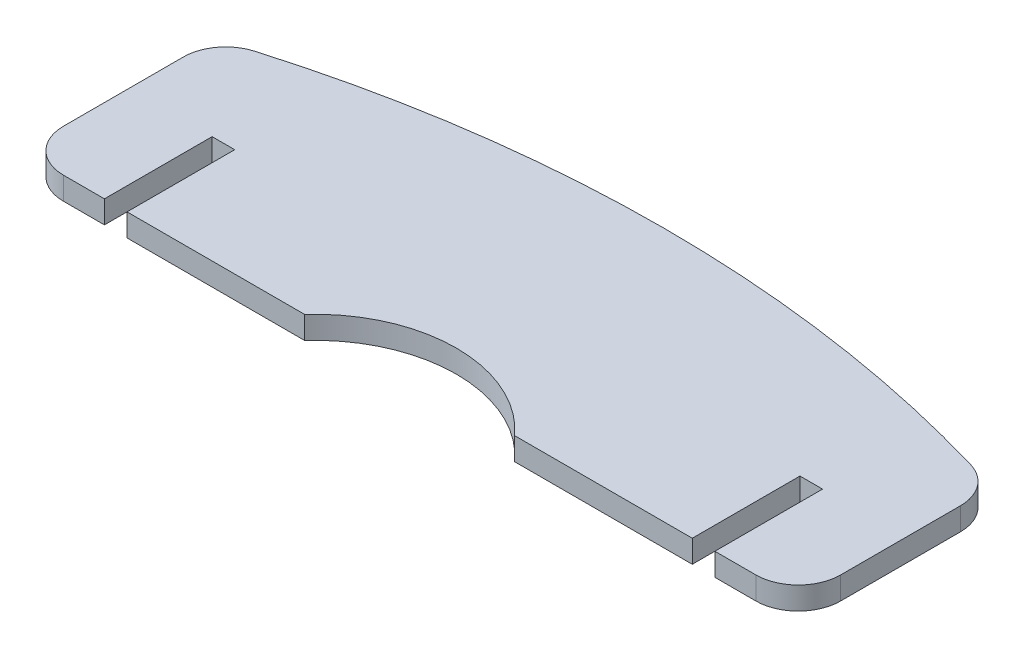
ISO-10303-21;
HEADER;
FILE_DESCRIPTION(('STEP AP214'),'2;1');
FILE_NAME('part.step','',(''),(''),'','','');
FILE_SCHEMA(('AUTOMOTIVE_DESIGN { 1 0 10303 214 1 1 1 1 }'));
ENDSEC;
DATA;
#1=APPLICATION_CONTEXT('core data for automotive mechanical design processes');
#2=APPLICATION_PROTOCOL_DEFINITION('international standard','automotive_design',2000,#1);
#3=PRODUCT_CONTEXT('',#1,'mechanical');
#4=PRODUCT('Part','Part','',(#3));
#5=PRODUCT_RELATED_PRODUCT_CATEGORY('part','',(#4));
#6=PRODUCT_DEFINITION_FORMATION('','',#4);
#7=PRODUCT_DEFINITION_CONTEXT('part definition',#1,'design');
#8=PRODUCT_DEFINITION('design','',#6,#7);
#9=PRODUCT_DEFINITION_SHAPE('','',#8);
#10=(LENGTH_UNIT() NAMED_UNIT(*) SI_UNIT(.MILLI.,.METRE.));
#11=(NAMED_UNIT(*) PLANE_ANGLE_UNIT() SI_UNIT($,.RADIAN.));
#12=(NAMED_UNIT(*) SI_UNIT($,.STERADIAN.) SOLID_ANGLE_UNIT());
#13=UNCERTAINTY_MEASURE_WITH_UNIT(LENGTH_MEASURE(1.E-05),#10,'distance_accuracy_value','');
#14=(GEOMETRIC_REPRESENTATION_CONTEXT(3) GLOBAL_UNCERTAINTY_ASSIGNED_CONTEXT((#13)) GLOBAL_UNIT_ASSIGNED_CONTEXT((#10,
#11,#12)) REPRESENTATION_CONTEXT('',''));
#15=CARTESIAN_POINT('',(0.,0.,0.));
#16=DIRECTION('',(0.,0.,1.));
#17=DIRECTION('',(1.,0.,0.));
#18=AXIS2_PLACEMENT_3D('',#15,#16,#17);
#19=CARTESIAN_POINT('',(-27.5,0.8,13.6956824379666));
#20=DIRECTION('',(0.,0.,-1.));
#21=DIRECTION('',(-1.,0.,0.));
#22=AXIS2_PLACEMENT_3D('',#19,#20,#21);
#23=PLANE('',#22);
#24=DIRECTION('',(1.,0.,0.));
#25=VECTOR('',#24,1.);
#26=CARTESIAN_POINT('',(-27.5,0.8,13.6956824379666));
#27=LINE('',#26,#25);
#28=CARTESIAN_POINT('',(7.42975818723065,0.799999999999995,13.6956824379666));
#29=VERTEX_POINT('',#28);
#30=CARTESIAN_POINT('',(20.,0.8,13.6956824379666));
#31=VERTEX_POINT('',#30);
#32=EDGE_CURVE('E178',#29,#31,#27,.T.);
#33=ORIENTED_EDGE('',*,*,#32,.F.);
#34=DIRECTION('',(0.,-1.,0.));
#35=VECTOR('',#34,1.);
#36=CARTESIAN_POINT('',(7.4297581872306,73.165824116084,13.6956824379666));
#37=LINE('',#36,#35);
#38=CARTESIAN_POINT('',(7.4297581872306,-0.799999999999995,13.6956824379666));
#39=VERTEX_POINT('',#38);
#40=EDGE_CURVE('E177',#29,#39,#37,.T.);
#41=ORIENTED_EDGE('',*,*,#40,.T.);
#42=DIRECTION('',(1.,0.,0.));
#43=VECTOR('',#42,1.);
#44=CARTESIAN_POINT('',(-27.5,-0.8,13.6956824379666));
#45=LINE('',#44,#43);
#46=CARTESIAN_POINT('',(20.,-0.8,13.6956824379666));
#47=VERTEX_POINT('',#46);
#48=EDGE_CURVE('E162',#39,#47,#45,.T.);
#49=ORIENTED_EDGE('',*,*,#48,.T.);
#50=DIRECTION('',(0.,1.,0.));
#51=VECTOR('',#50,1.);
#52=CARTESIAN_POINT('',(20.,-0.8,13.6956824379666));
#53=LINE('',#52,#51);
#54=EDGE_CURVE('E206',#47,#31,#53,.T.);
#55=ORIENTED_EDGE('',*,*,#54,.T.);
#56=EDGE_LOOP('',(#33,#41,#49,#55));
#57=FACE_BOUND('',#56,.T.);
#58=ADVANCED_FACE('F36',(#57),#23,.F.);
#59=CARTESIAN_POINT('',(21.6,0.8,13.6956824379666));
#60=VERTEX_POINT('',#59);
#61=CARTESIAN_POINT('',(24.5,0.8,13.6956824379666));
#62=VERTEX_POINT('',#61);
#63=EDGE_CURVE('E282',#60,#62,#27,.T.);
#64=ORIENTED_EDGE('',*,*,#63,.F.);
#65=DIRECTION('',(0.,1.,0.));
#66=VECTOR('',#65,1.);
#67=CARTESIAN_POINT('',(21.6,-0.8,13.6956824379666));
#68=LINE('',#67,#66);
#69=CARTESIAN_POINT('',(21.6,-0.8,13.6956824379666));
#70=VERTEX_POINT('',#69);
#71=EDGE_CURVE('E204',#70,#60,#68,.T.);
#72=ORIENTED_EDGE('',*,*,#71,.F.);
#73=CARTESIAN_POINT('',(24.5,-0.8,13.6956824379666));
#74=VERTEX_POINT('',#73);
#75=EDGE_CURVE('E173',#70,#74,#45,.T.);
#76=ORIENTED_EDGE('',*,*,#75,.T.);
#77=DIRECTION('',(0.,1.,0.));
#78=VECTOR('',#77,1.);
#79=CARTESIAN_POINT('',(24.5,-0.8,13.6956824379666));
#80=LINE('',#79,#78);
#81=EDGE_CURVE('E255',#74,#62,#80,.T.);
#82=ORIENTED_EDGE('',*,*,#81,.T.);
#83=EDGE_LOOP('',(#64,#72,#76,#82));
#84=FACE_BOUND('',#83,.T.);
#85=ADVANCED_FACE('F319',(#84),#23,.F.);
#86=CARTESIAN_POINT('',(-24.5,-0.8,13.6956824379666));
#87=VERTEX_POINT('',#86);
#88=CARTESIAN_POINT('',(-21.6,-0.8,13.6956824379666));
#89=VERTEX_POINT('',#88);
#90=EDGE_CURVE('E175',#87,#89,#45,.T.);
#91=ORIENTED_EDGE('',*,*,#90,.T.);
#92=DIRECTION('',(0.,1.,0.));
#93=VECTOR('',#92,1.);
#94=CARTESIAN_POINT('',(-21.6,-0.8,13.6956824379666));
#95=LINE('',#94,#93);
#96=CARTESIAN_POINT('',(-21.6,0.8,13.6956824379666));
#97=VERTEX_POINT('',#96);
#98=EDGE_CURVE('E219',#89,#97,#95,.T.);
#99=ORIENTED_EDGE('',*,*,#98,.T.);
#100=CARTESIAN_POINT('',(-24.5,0.8,13.6956824379666));
#101=VERTEX_POINT('',#100);
#102=EDGE_CURVE('E283',#101,#97,#27,.T.);
#103=ORIENTED_EDGE('',*,*,#102,.F.);
#104=DIRECTION('',(0.,1.,0.));
#105=VECTOR('',#104,1.);
#106=CARTESIAN_POINT('',(-24.5,-0.8,13.6956824379666));
#107=LINE('',#106,#105);
#108=EDGE_CURVE('E259',#87,#101,#107,.T.);
#109=ORIENTED_EDGE('',*,*,#108,.F.);
#110=EDGE_LOOP('',(#91,#99,#103,#109));
#111=FACE_BOUND('',#110,.T.);
#112=ADVANCED_FACE('F338',(#111),#23,.F.);
#113=CARTESIAN_POINT('',(0.,0.8,85.695681103124));
#114=DIRECTION('',(0.,-1.,0.));
#115=DIRECTION('',(0.,0.,-1.));
#116=AXIS2_PLACEMENT_3D('',#113,#114,#115);
#117=CYLINDRICAL_SURFACE('',#116,89.9999986651574);
#118=CARTESIAN_POINT('',(0.,-0.8,85.695681103124));
#119=DIRECTION('',(0.,1.,0.));
#120=DIRECTION('',(0.,0.,-1.));
#121=AXIS2_PLACEMENT_3D('',#118,#119,#120);
#122=CIRCLE('',#121,89.9999986651574);
#123=CARTESIAN_POINT('',(25.3448275991691,-0.8,-0.661944348811162));
#124=VERTEX_POINT('',#123);
#125=CARTESIAN_POINT('',(-25.3448275991691,-0.8,-0.661944348811144));
#126=VERTEX_POINT('',#125);
#127=EDGE_CURVE('E258',#124,#126,#122,.T.);
#128=ORIENTED_EDGE('',*,*,#127,.T.);
#129=DIRECTION('',(0.,1.,0.));
#130=VECTOR('',#129,1.);
#131=CARTESIAN_POINT('',(-25.3448275991691,-0.8,-0.661944348811144));
#132=LINE('',#131,#130);
#133=CARTESIAN_POINT('',(-25.3448275991691,0.8,-0.661944348811144));
#134=VERTEX_POINT('',#133);
#135=EDGE_CURVE('E266',#126,#134,#132,.T.);
#136=ORIENTED_EDGE('',*,*,#135,.T.);
#137=CARTESIAN_POINT('',(0.,0.8,85.695681103124));
#138=DIRECTION('',(0.,1.,0.));
#139=DIRECTION('',(0.,0.,-1.));
#140=AXIS2_PLACEMENT_3D('',#137,#138,#139);
#141=CIRCLE('',#140,89.9999986651574);
#142=CARTESIAN_POINT('',(25.3448275991691,0.8,-0.661944348811162));
#143=VERTEX_POINT('',#142);
#144=EDGE_CURVE('E275',#143,#134,#141,.T.);
#145=ORIENTED_EDGE('',*,*,#144,.F.);
#146=DIRECTION('',(0.,1.,0.));
#147=VECTOR('',#146,1.);
#148=CARTESIAN_POINT('',(25.3448275991691,-0.8,-0.661944348811162));
#149=LINE('',#148,#147);
#150=EDGE_CURVE('E269',#124,#143,#149,.T.);
#151=ORIENTED_EDGE('',*,*,#150,.F.);
#152=EDGE_LOOP('',(#128,#136,#145,#151));
#153=FACE_BOUND('',#152,.T.);
#154=ADVANCED_FACE('F38',(#153),#117,.T.);
#155=CARTESIAN_POINT('',(-27.5,0.8,0.));
#156=DIRECTION('',(1.,0.,0.));
#157=DIRECTION('',(0.,0.,-1.));
#158=AXIS2_PLACEMENT_3D('',#155,#156,#157);
#159=PLANE('',#158);
#160=DIRECTION('',(0.,0.,1.));
#161=VECTOR('',#160,1.);
#162=CARTESIAN_POINT('',(-27.5,-0.8,0.));
#163=LINE('',#162,#161);
#164=CARTESIAN_POINT('',(-27.5,-0.8,2.21664320894735));
#165=VERTEX_POINT('',#164);
#166=CARTESIAN_POINT('',(-27.5,-0.8,10.6956824379666));
#167=VERTEX_POINT('',#166);
#168=EDGE_CURVE('E291',#165,#167,#163,.T.);
#169=ORIENTED_EDGE('',*,*,#168,.T.);
#170=DIRECTION('',(0.,1.,0.));
#171=VECTOR('',#170,1.);
#172=CARTESIAN_POINT('',(-27.5,-0.8,10.6956824379667));
#173=LINE('',#172,#171);
#174=CARTESIAN_POINT('',(-27.5,0.8,10.6956824379667));
#175=VERTEX_POINT('',#174);
#176=EDGE_CURVE('E261',#167,#175,#173,.T.);
#177=ORIENTED_EDGE('',*,*,#176,.T.);
#178=DIRECTION('',(0.,0.,1.));
#179=VECTOR('',#178,1.);
#180=CARTESIAN_POINT('',(-27.5,0.8,0.));
#181=LINE('',#180,#179);
#182=CARTESIAN_POINT('',(-27.5,0.8,2.21664320894735));
#183=VERTEX_POINT('',#182);
#184=EDGE_CURVE('E278',#183,#175,#181,.T.);
#185=ORIENTED_EDGE('',*,*,#184,.F.);
#186=DIRECTION('',(0.,1.,0.));
#187=VECTOR('',#186,1.);
#188=CARTESIAN_POINT('',(-27.5,-0.8,2.21664320894735));
#189=LINE('',#188,#187);
#190=EDGE_CURVE('E264',#165,#183,#189,.T.);
#191=ORIENTED_EDGE('',*,*,#190,.F.);
#192=EDGE_LOOP('',(#169,#177,#185,#191));
#193=FACE_BOUND('',#192,.T.);
#194=ADVANCED_FACE('F344',(#193),#159,.F.);
#195=CARTESIAN_POINT('',(-20.,-0.8,13.6956824379666));
#196=VERTEX_POINT('',#195);
#197=CARTESIAN_POINT('',(-7.42975818723044,-0.799999999999995,13.6956824379666));
#198=VERTEX_POINT('',#197);
#199=EDGE_CURVE('E172',#196,#198,#45,.T.);
#200=ORIENTED_EDGE('',*,*,#199,.T.);
#201=DIRECTION('',(0.,-1.,0.));
#202=VECTOR('',#201,1.);
#203=CARTESIAN_POINT('',(-7.42975818723049,73.165824116084,13.6956824379667));
#204=LINE('',#203,#202);
#205=CARTESIAN_POINT('',(-7.42975818723044,0.799999999999995,13.6956824379666));
#206=VERTEX_POINT('',#205);
#207=EDGE_CURVE('E59',#206,#198,#204,.T.);
#208=ORIENTED_EDGE('',*,*,#207,.F.);
#209=CARTESIAN_POINT('',(-20.,0.8,13.6956824379666));
#210=VERTEX_POINT('',#209);
#211=EDGE_CURVE('E286',#210,#206,#27,.T.);
#212=ORIENTED_EDGE('',*,*,#211,.F.);
#213=DIRECTION('',(0.,1.,0.));
#214=VECTOR('',#213,1.);
#215=CARTESIAN_POINT('',(-20.,-0.8,13.6956824379666));
#216=LINE('',#215,#214);
#217=EDGE_CURVE('E231',#196,#210,#216,.T.);
#218=ORIENTED_EDGE('',*,*,#217,.F.);
#219=EDGE_LOOP('',(#200,#208,#212,#218));
#220=FACE_BOUND('',#219,.T.);
#221=ADVANCED_FACE('F322',(#220),#23,.F.);
#222=CARTESIAN_POINT('',(27.5,0.8,0.));
#223=DIRECTION('',(-1.,0.,0.));
#224=DIRECTION('',(0.,0.,1.));
#225=AXIS2_PLACEMENT_3D('',#222,#223,#224);
#226=PLANE('',#225);
#227=DIRECTION('',(0.,1.,0.));
#228=VECTOR('',#227,1.);
#229=CARTESIAN_POINT('',(27.5,-0.8,10.6956824379666));
#230=LINE('',#229,#228);
#231=CARTESIAN_POINT('',(27.5,-0.8,10.6956824379666));
#232=VERTEX_POINT('',#231);
#233=CARTESIAN_POINT('',(27.5,0.8,10.6956824379666));
#234=VERTEX_POINT('',#233);
#235=EDGE_CURVE('E244',#232,#234,#230,.T.);
#236=ORIENTED_EDGE('',*,*,#235,.F.);
#237=DIRECTION('',(0.,0.,-1.));
#238=VECTOR('',#237,1.);
#239=CARTESIAN_POINT('',(27.5,-0.8,0.));
#240=LINE('',#239,#238);
#241=CARTESIAN_POINT('',(27.5,-0.8,2.21664320894735));
#242=VERTEX_POINT('',#241);
#243=EDGE_CURVE('E279',#232,#242,#240,.T.);
#244=ORIENTED_EDGE('',*,*,#243,.T.);
#245=DIRECTION('',(0.,1.,0.));
#246=VECTOR('',#245,1.);
#247=CARTESIAN_POINT('',(27.5,-0.8,2.21664320894735));
#248=LINE('',#247,#246);
#249=CARTESIAN_POINT('',(27.5,0.8,2.21664320894735));
#250=VERTEX_POINT('',#249);
#251=EDGE_CURVE('E271',#242,#250,#248,.T.);
#252=ORIENTED_EDGE('',*,*,#251,.T.);
#253=DIRECTION('',(0.,0.,-1.));
#254=VECTOR('',#253,1.);
#255=CARTESIAN_POINT('',(27.5,0.8,0.));
#256=LINE('',#255,#254);
#257=EDGE_CURVE('E44',#234,#250,#256,.T.);
#258=ORIENTED_EDGE('',*,*,#257,.F.);
#259=EDGE_LOOP('',(#236,#244,#252,#258));
#260=FACE_BOUND('',#259,.T.);
#261=ADVANCED_FACE('F298',(#260),#226,.F.);
#262=CARTESIAN_POINT('',(0.,0.8,85.695681103124));
#263=DIRECTION('',(0.,-1.,0.));
#264=DIRECTION('',(0.,0.,-1.));
#265=AXIS2_PLACEMENT_3D('',#262,#263,#264);
#266=PLANE('',#265);
#267=ORIENTED_EDGE('',*,*,#211,.T.);
#268=CARTESIAN_POINT('',(1.06566105375098E-13,0.799999999999995,20.3888650351531));
#269=DIRECTION('',(0.,-1.,0.));
#270=DIRECTION('',(0.,0.,-1.));
#271=AXIS2_PLACEMENT_3D('',#268,#269,#270);
#272=CIRCLE('',#271,9.99999999999992);
#273=EDGE_CURVE('E51',#206,#29,#272,.T.);
#274=ORIENTED_EDGE('',*,*,#273,.T.);
#275=ORIENTED_EDGE('',*,*,#32,.T.);
#276=DIRECTION('',(0.,0.,1.));
#277=VECTOR('',#276,1.);
#278=CARTESIAN_POINT('',(20.,0.8,6.07568243796665));
#279=LINE('',#278,#277);
#280=CARTESIAN_POINT('',(20.,0.8,6.07568243796665));
#281=VERTEX_POINT('',#280);
#282=EDGE_CURVE('E196',#281,#31,#279,.T.);
#283=ORIENTED_EDGE('',*,*,#282,.F.);
#284=DIRECTION('',(-1.,0.,0.));
#285=VECTOR('',#284,1.);
#286=CARTESIAN_POINT('',(21.6,0.8,6.07568243796665));
#287=LINE('',#286,#285);
#288=CARTESIAN_POINT('',(21.6,0.8,6.07568243796665));
#289=VERTEX_POINT('',#288);
#290=EDGE_CURVE('E185',#289,#281,#287,.T.);
#291=ORIENTED_EDGE('',*,*,#290,.F.);
#292=DIRECTION('',(0.,0.,-1.));
#293=VECTOR('',#292,1.);
#294=CARTESIAN_POINT('',(21.6,0.8,6.07568243796665));
#295=LINE('',#294,#293);
#296=EDGE_CURVE('E188',#60,#289,#295,.T.);
#297=ORIENTED_EDGE('',*,*,#296,.F.);
#298=ORIENTED_EDGE('',*,*,#63,.T.);
#299=CARTESIAN_POINT('',(24.5,0.8,10.6956824379666));
#300=DIRECTION('',(0.,1.,0.));
#301=DIRECTION('',(0.,0.,1.));
#302=AXIS2_PLACEMENT_3D('',#299,#300,#301);
#303=CIRCLE('',#302,3.);
#304=EDGE_CURVE('E228',#62,#234,#303,.T.);
#305=ORIENTED_EDGE('',*,*,#304,.T.);
#306=ORIENTED_EDGE('',*,*,#257,.T.);
#307=CARTESIAN_POINT('',(24.5,0.8,2.21664320894735));
#308=DIRECTION('',(0.,1.,0.));
#309=DIRECTION('',(0.,0.,-1.));
#310=AXIS2_PLACEMENT_3D('',#307,#308,#309);
#311=CIRCLE('',#310,2.99999999999999);
#312=EDGE_CURVE('E247',#250,#143,#311,.T.);
#313=ORIENTED_EDGE('',*,*,#312,.T.);
#314=ORIENTED_EDGE('',*,*,#144,.T.);
#315=CARTESIAN_POINT('',(-24.5,0.8,2.21664320894735));
#316=DIRECTION('',(0.,1.,0.));
#317=DIRECTION('',(0.,0.,1.));
#318=AXIS2_PLACEMENT_3D('',#315,#316,#317);
#319=CIRCLE('',#318,2.99999999999999);
#320=EDGE_CURVE('E250',#134,#183,#319,.T.);
#321=ORIENTED_EDGE('',*,*,#320,.T.);
#322=ORIENTED_EDGE('',*,*,#184,.T.);
#323=CARTESIAN_POINT('',(-24.5,0.8,10.6956824379667));
#324=DIRECTION('',(0.,1.,0.));
#325=DIRECTION('',(0.,0.,-1.));
#326=AXIS2_PLACEMENT_3D('',#323,#324,#325);
#327=CIRCLE('',#326,3.);
#328=EDGE_CURVE('E238',#175,#101,#327,.T.);
#329=ORIENTED_EDGE('',*,*,#328,.T.);
#330=ORIENTED_EDGE('',*,*,#102,.T.);
#331=DIRECTION('',(0.,0.,1.));
#332=VECTOR('',#331,1.);
#333=CARTESIAN_POINT('',(-21.6,0.8,6.07568243796665));
#334=LINE('',#333,#332);
#335=CARTESIAN_POINT('',(-21.6,0.8,6.07568243796665));
#336=VERTEX_POINT('',#335);
#337=EDGE_CURVE('E203',#336,#97,#334,.T.);
#338=ORIENTED_EDGE('',*,*,#337,.F.);
#339=DIRECTION('',(-1.,0.,0.));
#340=VECTOR('',#339,1.);
#341=CARTESIAN_POINT('',(-21.6,0.8,6.07568243796665));
#342=LINE('',#341,#340);
#343=CARTESIAN_POINT('',(-20.,0.8,6.07568243796665));
#344=VERTEX_POINT('',#343);
#345=EDGE_CURVE('E213',#344,#336,#342,.T.);
#346=ORIENTED_EDGE('',*,*,#345,.F.);
#347=DIRECTION('',(0.,0.,-1.));
#348=VECTOR('',#347,1.);
#349=CARTESIAN_POINT('',(-20.,0.8,6.07568243796665));
#350=LINE('',#349,#348);
#351=EDGE_CURVE('E221',#210,#344,#350,.T.);
#352=ORIENTED_EDGE('',*,*,#351,.F.);
#353=EDGE_LOOP('',(#267,#274,#275,#283,#291,#297,#298,#305,#306,#313,#314,#321,#322,#329,#330,
#338,#346,#352));
#354=FACE_BOUND('',#353,.T.);
#355=ADVANCED_FACE('F310',(#354),#266,.F.);
#356=CARTESIAN_POINT('',(0.,-0.8,85.695681103124));
#357=DIRECTION('',(0.,-1.,0.));
#358=DIRECTION('',(0.,0.,-1.));
#359=AXIS2_PLACEMENT_3D('',#356,#357,#358);
#360=PLANE('',#359);
#361=CARTESIAN_POINT('',(1.06566105375098E-13,-0.799999999999995,20.3888650351531));
#362=DIRECTION('',(0.,-1.,0.));
#363=DIRECTION('',(0.,0.,-1.));
#364=AXIS2_PLACEMENT_3D('',#361,#362,#363);
#365=CIRCLE('',#364,9.99999999999992);
#366=EDGE_CURVE('E12',#198,#39,#365,.T.);
#367=ORIENTED_EDGE('',*,*,#366,.F.);
#368=ORIENTED_EDGE('',*,*,#199,.F.);
#369=DIRECTION('',(0.,0.,-1.));
#370=VECTOR('',#369,1.);
#371=CARTESIAN_POINT('',(-20.,-0.8,6.07568243796665));
#372=LINE('',#371,#370);
#373=CARTESIAN_POINT('',(-20.,-0.8,6.07568243796665));
#374=VERTEX_POINT('',#373);
#375=EDGE_CURVE('E212',#196,#374,#372,.T.);
#376=ORIENTED_EDGE('',*,*,#375,.T.);
#377=DIRECTION('',(-1.,0.,0.));
#378=VECTOR('',#377,1.);
#379=CARTESIAN_POINT('',(-21.6,-0.8,6.07568243796665));
#380=LINE('',#379,#378);
#381=CARTESIAN_POINT('',(-21.6,-0.8,6.07568243796665));
#382=VERTEX_POINT('',#381);
#383=EDGE_CURVE('E216',#374,#382,#380,.T.);
#384=ORIENTED_EDGE('',*,*,#383,.T.);
#385=DIRECTION('',(0.,0.,1.));
#386=VECTOR('',#385,1.);
#387=CARTESIAN_POINT('',(-21.6,-0.8,6.07568243796665));
#388=LINE('',#387,#386);
#389=EDGE_CURVE('E209',#382,#89,#388,.T.);
#390=ORIENTED_EDGE('',*,*,#389,.T.);
#391=ORIENTED_EDGE('',*,*,#90,.F.);
#392=CARTESIAN_POINT('',(-24.5,-0.8,10.6956824379667));
#393=DIRECTION('',(0.,1.,0.));
#394=DIRECTION('',(0.,0.,-1.));
#395=AXIS2_PLACEMENT_3D('',#392,#393,#394);
#396=CIRCLE('',#395,3.);
#397=EDGE_CURVE('E242',#167,#87,#396,.T.);
#398=ORIENTED_EDGE('',*,*,#397,.F.);
#399=ORIENTED_EDGE('',*,*,#168,.F.);
#400=CARTESIAN_POINT('',(-24.5,-0.8,2.21664320894735));
#401=DIRECTION('',(0.,1.,0.));
#402=DIRECTION('',(0.,0.,1.));
#403=AXIS2_PLACEMENT_3D('',#400,#401,#402);
#404=CIRCLE('',#403,2.99999999999999);
#405=EDGE_CURVE('E240',#126,#165,#404,.T.);
#406=ORIENTED_EDGE('',*,*,#405,.F.);
#407=ORIENTED_EDGE('',*,*,#127,.F.);
#408=CARTESIAN_POINT('',(24.5,-0.8,2.21664320894735));
#409=DIRECTION('',(0.,1.,0.));
#410=DIRECTION('',(0.,0.,-1.));
#411=AXIS2_PLACEMENT_3D('',#408,#409,#410);
#412=CIRCLE('',#411,2.99999999999999);
#413=EDGE_CURVE('E237',#242,#124,#412,.T.);
#414=ORIENTED_EDGE('',*,*,#413,.F.);
#415=ORIENTED_EDGE('',*,*,#243,.F.);
#416=CARTESIAN_POINT('',(24.5,-0.8,10.6956824379666));
#417=DIRECTION('',(0.,1.,0.));
#418=DIRECTION('',(0.,0.,1.));
#419=AXIS2_PLACEMENT_3D('',#416,#417,#418);
#420=CIRCLE('',#419,3.);
#421=EDGE_CURVE('E235',#74,#232,#420,.T.);
#422=ORIENTED_EDGE('',*,*,#421,.F.);
#423=ORIENTED_EDGE('',*,*,#75,.F.);
#424=DIRECTION('',(0.,0.,-1.));
#425=VECTOR('',#424,1.);
#426=CARTESIAN_POINT('',(21.6,-0.8,6.07568243796665));
#427=LINE('',#426,#425);
#428=CARTESIAN_POINT('',(21.6,-0.8,6.07568243796665));
#429=VERTEX_POINT('',#428);
#430=EDGE_CURVE('E190',#70,#429,#427,.T.);
#431=ORIENTED_EDGE('',*,*,#430,.T.);
#432=DIRECTION('',(-1.,0.,0.));
#433=VECTOR('',#432,1.);
#434=CARTESIAN_POINT('',(21.6,-0.8,6.07568243796665));
#435=LINE('',#434,#433);
#436=CARTESIAN_POINT('',(20.,-0.8,6.07568243796665));
#437=VERTEX_POINT('',#436);
#438=EDGE_CURVE('E186',#429,#437,#435,.T.);
#439=ORIENTED_EDGE('',*,*,#438,.T.);
#440=DIRECTION('',(0.,0.,1.));
#441=VECTOR('',#440,1.);
#442=CARTESIAN_POINT('',(20.,-0.8,6.07568243796665));
#443=LINE('',#442,#441);
#444=EDGE_CURVE('E168',#437,#47,#443,.T.);
#445=ORIENTED_EDGE('',*,*,#444,.T.);
#446=ORIENTED_EDGE('',*,*,#48,.F.);
#447=EDGE_LOOP('',(#367,#368,#376,#384,#390,#391,#398,#399,#406,#407,#414,#415,#422,#423,#431,
#439,#445,#446));
#448=FACE_BOUND('',#447,.T.);
#449=ADVANCED_FACE('F164',(#448),#360,.T.);
#450=CARTESIAN_POINT('',(24.5,-0.8,2.21664320894735));
#451=DIRECTION('',(0.,1.,0.));
#452=DIRECTION('',(0.,0.,1.));
#453=AXIS2_PLACEMENT_3D('',#450,#451,#452);
#454=CYLINDRICAL_SURFACE('',#453,2.99999999999999);
#455=ORIENTED_EDGE('',*,*,#312,.F.);
#456=ORIENTED_EDGE('',*,*,#251,.F.);
#457=ORIENTED_EDGE('',*,*,#413,.T.);
#458=ORIENTED_EDGE('',*,*,#150,.T.);
#459=EDGE_LOOP('',(#455,#456,#457,#458));
#460=FACE_BOUND('',#459,.T.);
#461=ADVANCED_FACE('F307',(#460),#454,.T.);
#462=CARTESIAN_POINT('',(-24.5,-0.8,2.21664320894735));
#463=DIRECTION('',(0.,1.,0.));
#464=DIRECTION('',(0.,0.,1.));
#465=AXIS2_PLACEMENT_3D('',#462,#463,#464);
#466=CYLINDRICAL_SURFACE('',#465,2.99999999999999);
#467=ORIENTED_EDGE('',*,*,#320,.F.);
#468=ORIENTED_EDGE('',*,*,#135,.F.);
#469=ORIENTED_EDGE('',*,*,#405,.T.);
#470=ORIENTED_EDGE('',*,*,#190,.T.);
#471=EDGE_LOOP('',(#467,#468,#469,#470));
#472=FACE_BOUND('',#471,.T.);
#473=ADVANCED_FACE('F347',(#472),#466,.T.);
#474=CARTESIAN_POINT('',(-24.5,-0.8,10.6956824379667));
#475=DIRECTION('',(0.,1.,0.));
#476=DIRECTION('',(0.,0.,1.));
#477=AXIS2_PLACEMENT_3D('',#474,#475,#476);
#478=CYLINDRICAL_SURFACE('',#477,3.);
#479=ORIENTED_EDGE('',*,*,#328,.F.);
#480=ORIENTED_EDGE('',*,*,#176,.F.);
#481=ORIENTED_EDGE('',*,*,#397,.T.);
#482=ORIENTED_EDGE('',*,*,#108,.T.);
#483=EDGE_LOOP('',(#479,#480,#481,#482));
#484=FACE_BOUND('',#483,.T.);
#485=ADVANCED_FACE('F341',(#484),#478,.T.);
#486=CARTESIAN_POINT('',(24.5,-0.8,10.6956824379666));
#487=DIRECTION('',(0.,1.,0.));
#488=DIRECTION('',(0.,0.,1.));
#489=AXIS2_PLACEMENT_3D('',#486,#487,#488);
#490=CYLINDRICAL_SURFACE('',#489,3.);
#491=ORIENTED_EDGE('',*,*,#304,.F.);
#492=ORIENTED_EDGE('',*,*,#81,.F.);
#493=ORIENTED_EDGE('',*,*,#421,.T.);
#494=ORIENTED_EDGE('',*,*,#235,.T.);
#495=EDGE_LOOP('',(#491,#492,#493,#494));
#496=FACE_BOUND('',#495,.T.);
#497=ADVANCED_FACE('F317',(#496),#490,.T.);
#498=CARTESIAN_POINT('',(-21.6,-0.8,6.07568243796665));
#499=DIRECTION('',(-1.,0.,0.));
#500=DIRECTION('',(0.,0.,1.));
#501=AXIS2_PLACEMENT_3D('',#498,#499,#500);
#502=PLANE('',#501);
#503=ORIENTED_EDGE('',*,*,#337,.T.);
#504=ORIENTED_EDGE('',*,*,#98,.F.);
#505=ORIENTED_EDGE('',*,*,#389,.F.);
#506=DIRECTION('',(0.,1.,0.));
#507=VECTOR('',#506,1.);
#508=CARTESIAN_POINT('',(-21.6,-0.8,6.07568243796665));
#509=LINE('',#508,#507);
#510=EDGE_CURVE('E226',#382,#336,#509,.T.);
#511=ORIENTED_EDGE('',*,*,#510,.T.);
#512=EDGE_LOOP('',(#503,#504,#505,#511));
#513=FACE_BOUND('',#512,.T.);
#514=ADVANCED_FACE('F333',(#513),#502,.F.);
#515=CARTESIAN_POINT('',(-21.6,-0.8,6.07568243796665));
#516=DIRECTION('',(0.,0.,-1.));
#517=DIRECTION('',(-1.,0.,0.));
#518=AXIS2_PLACEMENT_3D('',#515,#516,#517);
#519=PLANE('',#518);
#520=ORIENTED_EDGE('',*,*,#345,.T.);
#521=ORIENTED_EDGE('',*,*,#510,.F.);
#522=ORIENTED_EDGE('',*,*,#383,.F.);
#523=DIRECTION('',(0.,1.,0.));
#524=VECTOR('',#523,1.);
#525=CARTESIAN_POINT('',(-20.,-0.8,6.07568243796665));
#526=LINE('',#525,#524);
#527=EDGE_CURVE('E229',#374,#344,#526,.T.);
#528=ORIENTED_EDGE('',*,*,#527,.T.);
#529=EDGE_LOOP('',(#520,#521,#522,#528));
#530=FACE_BOUND('',#529,.T.);
#531=ADVANCED_FACE('F329',(#530),#519,.F.);
#532=CARTESIAN_POINT('',(-20.,-0.8,6.07568243796665));
#533=DIRECTION('',(1.,0.,0.));
#534=DIRECTION('',(0.,0.,-1.));
#535=AXIS2_PLACEMENT_3D('',#532,#533,#534);
#536=PLANE('',#535);
#537=ORIENTED_EDGE('',*,*,#351,.T.);
#538=ORIENTED_EDGE('',*,*,#527,.F.);
#539=ORIENTED_EDGE('',*,*,#375,.F.);
#540=ORIENTED_EDGE('',*,*,#217,.T.);
#541=EDGE_LOOP('',(#537,#538,#539,#540));
#542=FACE_BOUND('',#541,.T.);
#543=ADVANCED_FACE('F325',(#542),#536,.F.);
#544=CARTESIAN_POINT('',(21.6,-0.8,6.07568243796665));
#545=DIRECTION('',(0.,0.,-1.));
#546=DIRECTION('',(-1.,0.,0.));
#547=AXIS2_PLACEMENT_3D('',#544,#545,#546);
#548=PLANE('',#547);
#549=ORIENTED_EDGE('',*,*,#290,.T.);
#550=DIRECTION('',(0.,1.,0.));
#551=VECTOR('',#550,1.);
#552=CARTESIAN_POINT('',(20.,-0.8,6.07568243796665));
#553=LINE('',#552,#551);
#554=EDGE_CURVE('E193',#437,#281,#553,.T.);
#555=ORIENTED_EDGE('',*,*,#554,.F.);
#556=ORIENTED_EDGE('',*,*,#438,.F.);
#557=DIRECTION('',(0.,1.,0.));
#558=VECTOR('',#557,1.);
#559=CARTESIAN_POINT('',(21.6,-0.8,6.07568243796665));
#560=LINE('',#559,#558);
#561=EDGE_CURVE('E201',#429,#289,#560,.T.);
#562=ORIENTED_EDGE('',*,*,#561,.T.);
#563=EDGE_LOOP('',(#549,#555,#556,#562));
#564=FACE_BOUND('',#563,.T.);
#565=ADVANCED_FACE('F446',(#564),#548,.F.);
#566=CARTESIAN_POINT('',(21.6,-0.8,6.07568243796665));
#567=DIRECTION('',(1.,0.,0.));
#568=DIRECTION('',(0.,0.,-1.));
#569=AXIS2_PLACEMENT_3D('',#566,#567,#568);
#570=PLANE('',#569);
#571=ORIENTED_EDGE('',*,*,#296,.T.);
#572=ORIENTED_EDGE('',*,*,#561,.F.);
#573=ORIENTED_EDGE('',*,*,#430,.F.);
#574=ORIENTED_EDGE('',*,*,#71,.T.);
#575=EDGE_LOOP('',(#571,#572,#573,#574));
#576=FACE_BOUND('',#575,.T.);
#577=ADVANCED_FACE('F455',(#576),#570,.F.);
#578=CARTESIAN_POINT('',(20.,-0.8,6.07568243796665));
#579=DIRECTION('',(-1.,0.,0.));
#580=DIRECTION('',(0.,0.,1.));
#581=AXIS2_PLACEMENT_3D('',#578,#579,#580);
#582=PLANE('',#581);
#583=ORIENTED_EDGE('',*,*,#282,.T.);
#584=ORIENTED_EDGE('',*,*,#54,.F.);
#585=ORIENTED_EDGE('',*,*,#444,.F.);
#586=ORIENTED_EDGE('',*,*,#554,.T.);
#587=EDGE_LOOP('',(#583,#584,#585,#586));
#588=FACE_BOUND('',#587,.T.);
#589=ADVANCED_FACE('F465',(#588),#582,.F.);
#590=CARTESIAN_POINT('',(1.06566105375098E-13,73.165824116084,20.3888650351531));
#591=DIRECTION('',(0.,-1.,0.));
#592=DIRECTION('',(0.,0.,-1.));
#593=AXIS2_PLACEMENT_3D('',#590,#591,#592);
#594=CYLINDRICAL_SURFACE('',#593,9.99999999999992);
#595=ORIENTED_EDGE('',*,*,#273,.F.);
#596=ORIENTED_EDGE('',*,*,#207,.T.);
#597=ORIENTED_EDGE('',*,*,#366,.T.);
#598=ORIENTED_EDGE('',*,*,#40,.F.);
#599=EDGE_LOOP('',(#595,#596,#597,#598));
#600=FACE_BOUND('',#599,.T.);
#601=ADVANCED_FACE('F181',(#600),#594,.F.);
#602=CLOSED_SHELL('',(#58,#85,#112,#154,#194,#221,#261,#355,#449,#461,#473,#485,#497,#514,#531,
#543,#565,#577,#589,#601));
#603=MANIFOLD_SOLID_BREP('B2',#602);
#604=ADVANCED_BREP_SHAPE_REPRESENTATION('',(#18,#603),#14);
#605=SHAPE_DEFINITION_REPRESENTATION(#9,#604);
ENDSEC;
END-ISO-10303-21;
